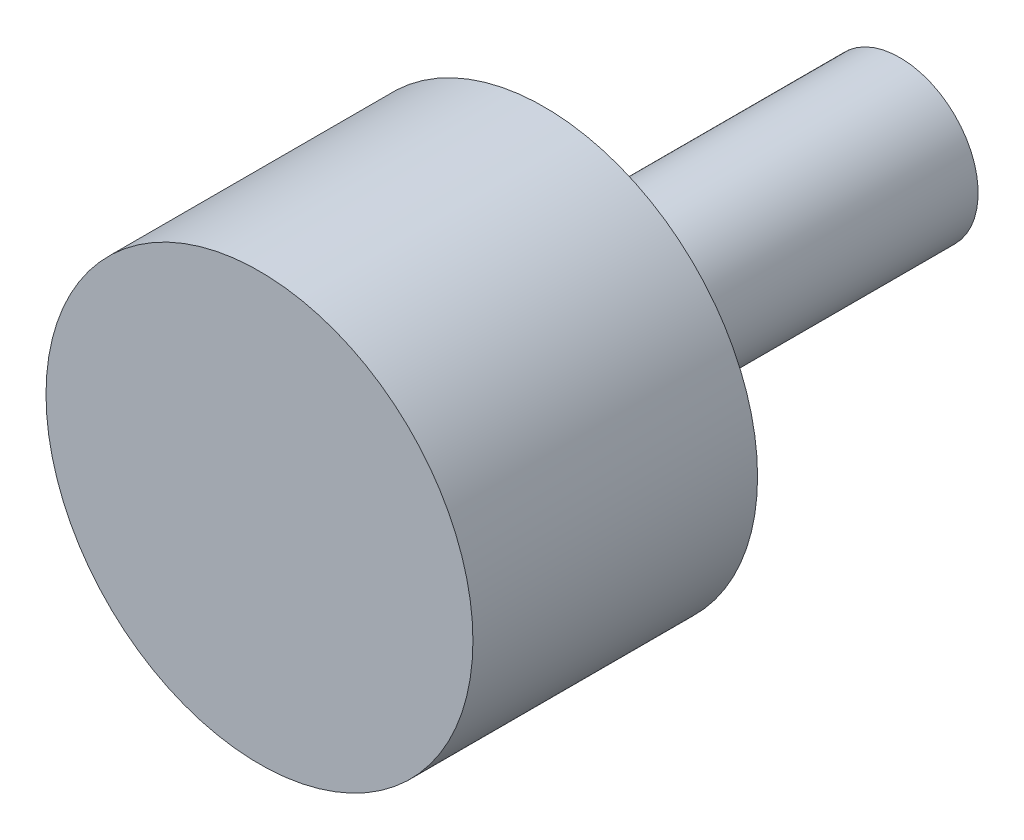
ISO-10303-21;
HEADER;
FILE_DESCRIPTION(('STEP AP214'),'2;1');
FILE_NAME('part.step','',(''),(''),'','','');
FILE_SCHEMA(('AUTOMOTIVE_DESIGN { 1 0 10303 214 1 1 1 1 }'));
ENDSEC;
DATA;
#1=APPLICATION_CONTEXT('core data for automotive mechanical design processes');
#2=APPLICATION_PROTOCOL_DEFINITION('international standard','automotive_design',2000,#1);
#3=PRODUCT_CONTEXT('',#1,'mechanical');
#4=PRODUCT('Part','Part','',(#3));
#5=PRODUCT_RELATED_PRODUCT_CATEGORY('part','',(#4));
#6=PRODUCT_DEFINITION_FORMATION('','',#4);
#7=PRODUCT_DEFINITION_CONTEXT('part definition',#1,'design');
#8=PRODUCT_DEFINITION('design','',#6,#7);
#9=PRODUCT_DEFINITION_SHAPE('','',#8);
#10=(LENGTH_UNIT() NAMED_UNIT(*) SI_UNIT(.MILLI.,.METRE.));
#11=(NAMED_UNIT(*) PLANE_ANGLE_UNIT() SI_UNIT($,.RADIAN.));
#12=(NAMED_UNIT(*) SI_UNIT($,.STERADIAN.) SOLID_ANGLE_UNIT());
#13=UNCERTAINTY_MEASURE_WITH_UNIT(LENGTH_MEASURE(1.E-05),#10,'distance_accuracy_value','');
#14=(GEOMETRIC_REPRESENTATION_CONTEXT(3) GLOBAL_UNCERTAINTY_ASSIGNED_CONTEXT((#13)) GLOBAL_UNIT_ASSIGNED_CONTEXT((#10,
#11,#12)) REPRESENTATION_CONTEXT('',''));
#15=CARTESIAN_POINT('',(0.,0.,0.));
#16=DIRECTION('',(0.,0.,1.));
#17=DIRECTION('',(1.,0.,0.));
#18=AXIS2_PLACEMENT_3D('',#15,#16,#17);
#19=CARTESIAN_POINT('',(0.,0.,20.));
#20=DIRECTION('',(0.,0.,-1.));
#21=DIRECTION('',(-1.,0.,0.));
#22=AXIS2_PLACEMENT_3D('',#19,#20,#21);
#23=CYLINDRICAL_SURFACE('',#22,15.);
#24=CARTESIAN_POINT('',(0.,0.,20.));
#25=DIRECTION('',(0.,0.,1.));
#26=DIRECTION('',(1.,0.,0.));
#27=AXIS2_PLACEMENT_3D('',#24,#25,#26);
#28=CIRCLE('',#27,15.);
#29=CARTESIAN_POINT('',(15.,0.,20.));
#30=VERTEX_POINT('',#29);
#31=EDGE_CURVE('E51',#30,#30,#28,.T.);
#32=ORIENTED_EDGE('',*,*,#31,.F.);
#33=EDGE_LOOP('',(#32));
#34=FACE_BOUND('',#33,.T.);
#35=CARTESIAN_POINT('',(0.,0.,0.));
#36=DIRECTION('',(0.,0.,1.));
#37=DIRECTION('',(1.,0.,0.));
#38=AXIS2_PLACEMENT_3D('',#35,#36,#37);
#39=CIRCLE('',#38,15.);
#40=CARTESIAN_POINT('',(15.,0.,0.));
#41=VERTEX_POINT('',#40);
#42=EDGE_CURVE('E46',#41,#41,#39,.T.);
#43=ORIENTED_EDGE('',*,*,#42,.T.);
#44=EDGE_LOOP('',(#43));
#45=FACE_BOUND('',#44,.T.);
#46=ADVANCED_FACE('F43',(#34,#45),#23,.T.);
#47=CARTESIAN_POINT('',(0.,0.,20.));
#48=DIRECTION('',(0.,0.,1.));
#49=DIRECTION('',(1.,0.,0.));
#50=AXIS2_PLACEMENT_3D('',#47,#48,#49);
#51=PLANE('',#50);
#52=ORIENTED_EDGE('',*,*,#31,.T.);
#53=EDGE_LOOP('',(#52));
#54=FACE_BOUND('',#53,.T.);
#55=ADVANCED_FACE('F71',(#54),#51,.T.);
#56=CARTESIAN_POINT('',(0.,0.,0.));
#57=DIRECTION('',(0.,0.,1.));
#58=DIRECTION('',(1.,0.,0.));
#59=AXIS2_PLACEMENT_3D('',#56,#57,#58);
#60=PLANE('',#59);
#61=CARTESIAN_POINT('',(0.,0.,0.));
#62=DIRECTION('',(0.,0.,-1.));
#63=DIRECTION('',(-1.,0.,0.));
#64=AXIS2_PLACEMENT_3D('',#61,#62,#63);
#65=CIRCLE('',#64,5.5);
#66=CARTESIAN_POINT('',(-5.5,0.,0.));
#67=VERTEX_POINT('',#66);
#68=EDGE_CURVE('E10',#67,#67,#65,.T.);
#69=ORIENTED_EDGE('',*,*,#68,.F.);
#70=EDGE_LOOP('',(#69));
#71=FACE_BOUND('',#70,.T.);
#72=ORIENTED_EDGE('',*,*,#42,.F.);
#73=EDGE_LOOP('',(#72));
#74=FACE_BOUND('',#73,.T.);
#75=ADVANCED_FACE('F68',(#71,#74),#60,.F.);
#76=CARTESIAN_POINT('',(0.,0.,-25.));
#77=DIRECTION('',(0.,0.,1.));
#78=DIRECTION('',(1.,0.,0.));
#79=AXIS2_PLACEMENT_3D('',#76,#77,#78);
#80=CYLINDRICAL_SURFACE('',#79,5.5);
#81=CARTESIAN_POINT('',(0.,0.,-25.));
#82=DIRECTION('',(0.,0.,-1.));
#83=DIRECTION('',(-1.,0.,0.));
#84=AXIS2_PLACEMENT_3D('',#81,#82,#83);
#85=CIRCLE('',#84,5.5);
#86=CARTESIAN_POINT('',(-5.5,0.,-25.));
#87=VERTEX_POINT('',#86);
#88=EDGE_CURVE('E58',#87,#87,#85,.T.);
#89=ORIENTED_EDGE('',*,*,#88,.F.);
#90=EDGE_LOOP('',(#89));
#91=FACE_BOUND('',#90,.T.);
#92=ORIENTED_EDGE('',*,*,#68,.T.);
#93=EDGE_LOOP('',(#92));
#94=FACE_BOUND('',#93,.T.);
#95=ADVANCED_FACE('F70',(#91,#94),#80,.T.);
#96=CARTESIAN_POINT('',(0.,0.,-25.));
#97=DIRECTION('',(0.,0.,-1.));
#98=DIRECTION('',(-1.,0.,0.));
#99=AXIS2_PLACEMENT_3D('',#96,#97,#98);
#100=PLANE('',#99);
#101=ORIENTED_EDGE('',*,*,#88,.T.);
#102=EDGE_LOOP('',(#101));
#103=FACE_BOUND('',#102,.T.);
#104=ADVANCED_FACE('F77',(#103),#100,.T.);
#105=CLOSED_SHELL('',(#46,#55,#75,#95,#104));
#106=MANIFOLD_SOLID_BREP('B2',#105);
#107=ADVANCED_BREP_SHAPE_REPRESENTATION('',(#18,#106),#14);
#108=SHAPE_DEFINITION_REPRESENTATION(#9,#107);
ENDSEC;
END-ISO-10303-21;
